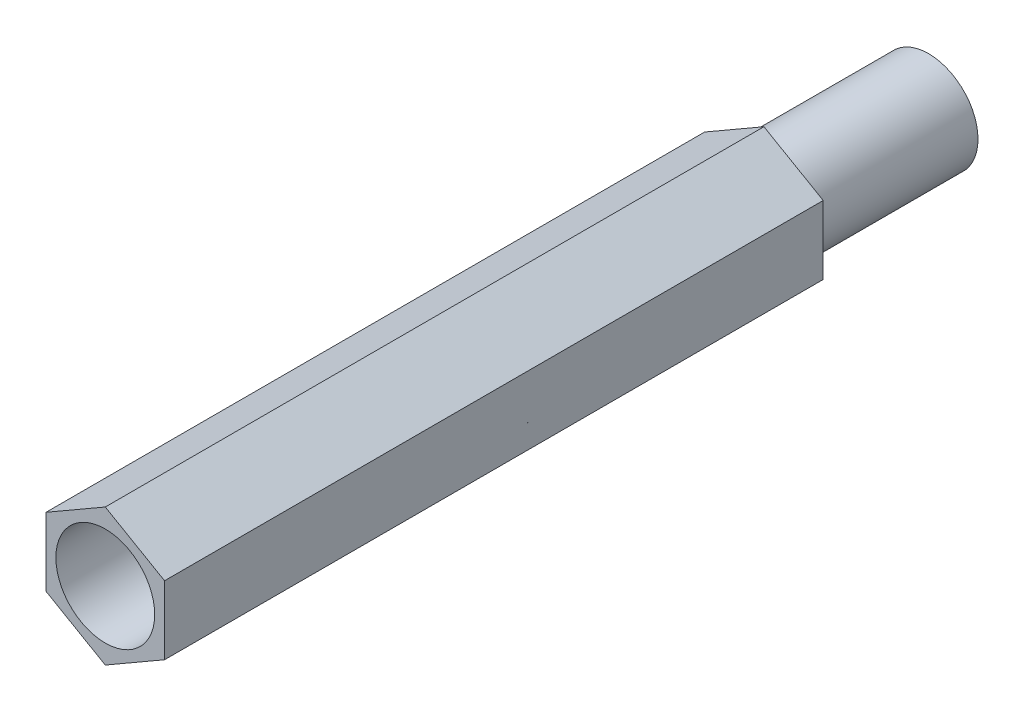
ISO-10303-21;
HEADER;
FILE_DESCRIPTION(('STEP AP214'),'2;1');
FILE_NAME('part.step','',(''),(''),'','','');
FILE_SCHEMA(('AUTOMOTIVE_DESIGN { 1 0 10303 214 1 1 1 1 }'));
ENDSEC;
DATA;
#1=APPLICATION_CONTEXT('core data for automotive mechanical design processes');
#2=APPLICATION_PROTOCOL_DEFINITION('international standard','automotive_design',2000,#1);
#3=PRODUCT_CONTEXT('',#1,'mechanical');
#4=PRODUCT('Part','Part','',(#3));
#5=PRODUCT_RELATED_PRODUCT_CATEGORY('part','',(#4));
#6=PRODUCT_DEFINITION_FORMATION('','',#4);
#7=PRODUCT_DEFINITION_CONTEXT('part definition',#1,'design');
#8=PRODUCT_DEFINITION('design','',#6,#7);
#9=PRODUCT_DEFINITION_SHAPE('','',#8);
#10=(LENGTH_UNIT() NAMED_UNIT(*) SI_UNIT(.MILLI.,.METRE.));
#11=(NAMED_UNIT(*) PLANE_ANGLE_UNIT() SI_UNIT($,.RADIAN.));
#12=(NAMED_UNIT(*) SI_UNIT($,.STERADIAN.) SOLID_ANGLE_UNIT());
#13=UNCERTAINTY_MEASURE_WITH_UNIT(LENGTH_MEASURE(1.E-05),#10,'distance_accuracy_value','');
#14=(GEOMETRIC_REPRESENTATION_CONTEXT(3) GLOBAL_UNCERTAINTY_ASSIGNED_CONTEXT((#13)) GLOBAL_UNIT_ASSIGNED_CONTEXT((#10,
#11,#12)) REPRESENTATION_CONTEXT('',''));
#15=CARTESIAN_POINT('',(0.,0.,0.));
#16=DIRECTION('',(0.,0.,1.));
#17=DIRECTION('',(1.,0.,0.));
#18=AXIS2_PLACEMENT_3D('',#15,#16,#17);
#19=CARTESIAN_POINT('',(0.,0.,20.));
#20=DIRECTION('',(0.,0.,-1.));
#21=DIRECTION('',(-1.,0.,0.));
#22=AXIS2_PLACEMENT_3D('',#19,#20,#21);
#23=CYLINDRICAL_SURFACE('',#22,1.5);
#24=CARTESIAN_POINT('',(0.,0.,20.));
#25=DIRECTION('',(0.,0.,1.));
#26=DIRECTION('',(1.,0.,0.));
#27=AXIS2_PLACEMENT_3D('',#24,#25,#26);
#28=CIRCLE('',#27,1.5);
#29=CARTESIAN_POINT('',(1.5,0.,20.));
#30=VERTEX_POINT('',#29);
#31=EDGE_CURVE('E141',#30,#30,#28,.T.);
#32=ORIENTED_EDGE('',*,*,#31,.T.);
#33=EDGE_LOOP('',(#32));
#34=FACE_BOUND('',#33,.T.);
#35=CARTESIAN_POINT('',(0.,0.,5.));
#36=DIRECTION('',(0.,0.,-1.));
#37=DIRECTION('',(-1.,0.,0.));
#38=AXIS2_PLACEMENT_3D('',#35,#36,#37);
#39=CIRCLE('',#38,1.5);
#40=CARTESIAN_POINT('',(-1.5,0.,5.));
#41=VERTEX_POINT('',#40);
#42=EDGE_CURVE('E258',#41,#41,#39,.T.);
#43=ORIENTED_EDGE('',*,*,#42,.T.);
#44=EDGE_LOOP('',(#43));
#45=FACE_BOUND('',#44,.T.);
#46=ADVANCED_FACE('F45',(#34,#45),#23,.F.);
#47=CARTESIAN_POINT('',(0.,0.,20.));
#48=DIRECTION('',(0.,0.,1.));
#49=DIRECTION('',(1.,0.,0.));
#50=AXIS2_PLACEMENT_3D('',#47,#48,#49);
#51=PLANE('',#50);
#52=DIRECTION('',(-0.866025403784439,0.5,0.));
#53=VECTOR('',#52,1.);
#54=CARTESIAN_POINT('',(1.8,1.03923048454133,20.));
#55=LINE('',#54,#53);
#56=CARTESIAN_POINT('',(1.8,1.03923048454133,20.));
#57=VERTEX_POINT('',#56);
#58=CARTESIAN_POINT('',(0.,2.07846096908265,20.));
#59=VERTEX_POINT('',#58);
#60=EDGE_CURVE('E153',#57,#59,#55,.T.);
#61=ORIENTED_EDGE('',*,*,#60,.T.);
#62=DIRECTION('',(-0.866025403784439,-0.5,0.));
#63=VECTOR('',#62,1.);
#64=CARTESIAN_POINT('',(0.,2.07846096908265,20.));
#65=LINE('',#64,#63);
#66=CARTESIAN_POINT('',(-1.8,1.03923048454133,20.));
#67=VERTEX_POINT('',#66);
#68=EDGE_CURVE('E100',#59,#67,#65,.T.);
#69=ORIENTED_EDGE('',*,*,#68,.T.);
#70=DIRECTION('',(0.,-1.,0.));
#71=VECTOR('',#70,1.);
#72=CARTESIAN_POINT('',(-1.8,1.03923048454133,20.));
#73=LINE('',#72,#71);
#74=CARTESIAN_POINT('',(-1.8,-1.03923048454133,20.));
#75=VERTEX_POINT('',#74);
#76=EDGE_CURVE('E114',#67,#75,#73,.T.);
#77=ORIENTED_EDGE('',*,*,#76,.T.);
#78=DIRECTION('',(0.866025403784439,-0.5,0.));
#79=VECTOR('',#78,1.);
#80=CARTESIAN_POINT('',(-1.8,-1.03923048454133,20.));
#81=LINE('',#80,#79);
#82=CARTESIAN_POINT('',(0.,-2.07846096908265,20.));
#83=VERTEX_POINT('',#82);
#84=EDGE_CURVE('E107',#75,#83,#81,.T.);
#85=ORIENTED_EDGE('',*,*,#84,.T.);
#86=DIRECTION('',(0.866025403784439,0.5,0.));
#87=VECTOR('',#86,1.);
#88=CARTESIAN_POINT('',(0.,-2.07846096908265,20.));
#89=LINE('',#88,#87);
#90=CARTESIAN_POINT('',(1.8,-1.03923048454133,20.));
#91=VERTEX_POINT('',#90);
#92=EDGE_CURVE('E112',#83,#91,#89,.T.);
#93=ORIENTED_EDGE('',*,*,#92,.T.);
#94=DIRECTION('',(0.,1.,0.));
#95=VECTOR('',#94,1.);
#96=CARTESIAN_POINT('',(1.8,-1.03923048454133,20.));
#97=LINE('',#96,#95);
#98=EDGE_CURVE('E63',#91,#57,#97,.T.);
#99=ORIENTED_EDGE('',*,*,#98,.T.);
#100=EDGE_LOOP('',(#61,#69,#77,#85,#93,#99));
#101=FACE_BOUND('',#100,.T.);
#102=ORIENTED_EDGE('',*,*,#31,.F.);
#103=EDGE_LOOP('',(#102));
#104=FACE_BOUND('',#103,.T.);
#105=ADVANCED_FACE('F109',(#101,#104),#51,.T.);
#106=CARTESIAN_POINT('',(0.,0.,0.));
#107=DIRECTION('',(0.,0.,1.));
#108=DIRECTION('',(1.,0.,0.));
#109=AXIS2_PLACEMENT_3D('',#106,#107,#108);
#110=PLANE('',#109);
#111=DIRECTION('',(-0.866025403784439,0.5,0.));
#112=VECTOR('',#111,1.);
#113=CARTESIAN_POINT('',(1.8,1.03923048454133,0.));
#114=LINE('',#113,#112);
#115=CARTESIAN_POINT('',(1.8,1.03923048454133,0.));
#116=VERTEX_POINT('',#115);
#117=CARTESIAN_POINT('',(0.,2.07846096908265,0.));
#118=VERTEX_POINT('',#117);
#119=EDGE_CURVE('E136',#116,#118,#114,.T.);
#120=ORIENTED_EDGE('',*,*,#119,.F.);
#121=DIRECTION('',(0.,1.,0.));
#122=VECTOR('',#121,1.);
#123=CARTESIAN_POINT('',(1.8,-1.03923048454133,0.));
#124=LINE('',#123,#122);
#125=CARTESIAN_POINT('',(1.8,-1.03923048454133,0.));
#126=VERTEX_POINT('',#125);
#127=EDGE_CURVE('E92',#126,#116,#124,.T.);
#128=ORIENTED_EDGE('',*,*,#127,.F.);
#129=DIRECTION('',(0.866025403784439,0.5,0.));
#130=VECTOR('',#129,1.);
#131=CARTESIAN_POINT('',(0.,-2.07846096908265,0.));
#132=LINE('',#131,#130);
#133=CARTESIAN_POINT('',(0.,-2.07846096908265,0.));
#134=VERTEX_POINT('',#133);
#135=EDGE_CURVE('E86',#134,#126,#132,.T.);
#136=ORIENTED_EDGE('',*,*,#135,.F.);
#137=DIRECTION('',(0.866025403784439,-0.5,0.));
#138=VECTOR('',#137,1.);
#139=CARTESIAN_POINT('',(-1.8,-1.03923048454133,0.));
#140=LINE('',#139,#138);
#141=CARTESIAN_POINT('',(-1.8,-1.03923048454133,0.));
#142=VERTEX_POINT('',#141);
#143=EDGE_CURVE('E123',#142,#134,#140,.T.);
#144=ORIENTED_EDGE('',*,*,#143,.F.);
#145=DIRECTION('',(0.,-1.,0.));
#146=VECTOR('',#145,1.);
#147=CARTESIAN_POINT('',(-1.8,1.03923048454133,0.));
#148=LINE('',#147,#146);
#149=CARTESIAN_POINT('',(-1.8,1.03923048454133,0.));
#150=VERTEX_POINT('',#149);
#151=EDGE_CURVE('E144',#150,#142,#148,.T.);
#152=ORIENTED_EDGE('',*,*,#151,.F.);
#153=DIRECTION('',(-0.866025403784439,-0.5,0.));
#154=VECTOR('',#153,1.);
#155=CARTESIAN_POINT('',(0.,2.07846096908265,0.));
#156=LINE('',#155,#154);
#157=EDGE_CURVE('E140',#118,#150,#156,.T.);
#158=ORIENTED_EDGE('',*,*,#157,.F.);
#159=EDGE_LOOP('',(#120,#128,#136,#144,#152,#158));
#160=FACE_BOUND('',#159,.T.);
#161=CARTESIAN_POINT('',(0.,0.,0.));
#162=DIRECTION('',(0.,0.,1.));
#163=DIRECTION('',(1.,0.,0.));
#164=AXIS2_PLACEMENT_3D('',#161,#162,#163);
#165=CIRCLE('',#164,1.5);
#166=CARTESIAN_POINT('',(1.5,0.,0.));
#167=VERTEX_POINT('',#166);
#168=EDGE_CURVE('E257',#167,#167,#165,.F.);
#169=ORIENTED_EDGE('',*,*,#168,.F.);
#170=EDGE_LOOP('',(#169));
#171=FACE_BOUND('',#170,.T.);
#172=ADVANCED_FACE('F166',(#160,#171),#110,.F.);
#173=CARTESIAN_POINT('',(1.8,1.03923048454133,20.));
#174=DIRECTION('',(-0.5,-0.866025403784439,0.));
#175=DIRECTION('',(0.866025403784439,-0.5,0.));
#176=AXIS2_PLACEMENT_3D('',#173,#174,#175);
#177=PLANE('',#176);
#178=ORIENTED_EDGE('',*,*,#119,.T.);
#179=DIRECTION('',(0.,0.,-1.));
#180=VECTOR('',#179,1.);
#181=CARTESIAN_POINT('',(0.,2.07846096908265,20.));
#182=LINE('',#181,#180);
#183=EDGE_CURVE('E11',#59,#118,#182,.T.);
#184=ORIENTED_EDGE('',*,*,#183,.F.);
#185=ORIENTED_EDGE('',*,*,#60,.F.);
#186=DIRECTION('',(0.,0.,-1.));
#187=VECTOR('',#186,1.);
#188=CARTESIAN_POINT('',(1.8,1.03923048454133,20.));
#189=LINE('',#188,#187);
#190=EDGE_CURVE('E132',#57,#116,#189,.T.);
#191=ORIENTED_EDGE('',*,*,#190,.T.);
#192=EDGE_LOOP('',(#178,#184,#185,#191));
#193=FACE_BOUND('',#192,.T.);
#194=ADVANCED_FACE('F47',(#193),#177,.F.);
#195=CARTESIAN_POINT('',(0.,2.07846096908265,20.));
#196=DIRECTION('',(0.5,-0.866025403784438,0.));
#197=DIRECTION('',(0.866025403784439,0.5,0.));
#198=AXIS2_PLACEMENT_3D('',#195,#196,#197);
#199=PLANE('',#198);
#200=ORIENTED_EDGE('',*,*,#157,.T.);
#201=DIRECTION('',(0.,0.,-1.));
#202=VECTOR('',#201,1.);
#203=CARTESIAN_POINT('',(-1.8,1.03923048454133,20.));
#204=LINE('',#203,#202);
#205=EDGE_CURVE('E55',#67,#150,#204,.T.);
#206=ORIENTED_EDGE('',*,*,#205,.F.);
#207=ORIENTED_EDGE('',*,*,#68,.F.);
#208=ORIENTED_EDGE('',*,*,#183,.T.);
#209=EDGE_LOOP('',(#200,#206,#207,#208));
#210=FACE_BOUND('',#209,.T.);
#211=ADVANCED_FACE('F198',(#210),#199,.F.);
#212=CARTESIAN_POINT('',(-1.8,1.03923048454133,20.));
#213=DIRECTION('',(1.,0.,0.));
#214=DIRECTION('',(0.,1.,0.));
#215=AXIS2_PLACEMENT_3D('',#212,#213,#214);
#216=PLANE('',#215);
#217=ORIENTED_EDGE('',*,*,#151,.T.);
#218=DIRECTION('',(0.,0.,-1.));
#219=VECTOR('',#218,1.);
#220=CARTESIAN_POINT('',(-1.8,-1.03923048454133,20.));
#221=LINE('',#220,#219);
#222=EDGE_CURVE('E125',#75,#142,#221,.T.);
#223=ORIENTED_EDGE('',*,*,#222,.F.);
#224=ORIENTED_EDGE('',*,*,#76,.F.);
#225=ORIENTED_EDGE('',*,*,#205,.T.);
#226=EDGE_LOOP('',(#217,#223,#224,#225));
#227=FACE_BOUND('',#226,.T.);
#228=ADVANCED_FACE('F163',(#227),#216,.F.);
#229=CARTESIAN_POINT('',(-1.8,-1.03923048454133,20.));
#230=DIRECTION('',(0.5,0.866025403784439,0.));
#231=DIRECTION('',(-0.866025403784439,0.5,0.));
#232=AXIS2_PLACEMENT_3D('',#229,#230,#231);
#233=PLANE('',#232);
#234=ORIENTED_EDGE('',*,*,#143,.T.);
#235=DIRECTION('',(0.,0.,-1.));
#236=VECTOR('',#235,1.);
#237=CARTESIAN_POINT('',(0.,-2.07846096908265,20.));
#238=LINE('',#237,#236);
#239=EDGE_CURVE('E120',#83,#134,#238,.T.);
#240=ORIENTED_EDGE('',*,*,#239,.F.);
#241=ORIENTED_EDGE('',*,*,#84,.F.);
#242=ORIENTED_EDGE('',*,*,#222,.T.);
#243=EDGE_LOOP('',(#234,#240,#241,#242));
#244=FACE_BOUND('',#243,.T.);
#245=ADVANCED_FACE('F121',(#244),#233,.F.);
#246=CARTESIAN_POINT('',(0.,-2.07846096908265,20.));
#247=DIRECTION('',(-0.5,0.866025403784439,0.));
#248=DIRECTION('',(-0.866025403784439,-0.5,0.));
#249=AXIS2_PLACEMENT_3D('',#246,#247,#248);
#250=PLANE('',#249);
#251=ORIENTED_EDGE('',*,*,#135,.T.);
#252=DIRECTION('',(0.,0.,-1.));
#253=VECTOR('',#252,1.);
#254=CARTESIAN_POINT('',(1.8,-1.03923048454133,20.));
#255=LINE('',#254,#253);
#256=EDGE_CURVE('E126',#91,#126,#255,.T.);
#257=ORIENTED_EDGE('',*,*,#256,.F.);
#258=ORIENTED_EDGE('',*,*,#92,.F.);
#259=ORIENTED_EDGE('',*,*,#239,.T.);
#260=EDGE_LOOP('',(#251,#257,#258,#259));
#261=FACE_BOUND('',#260,.T.);
#262=ADVANCED_FACE('F128',(#261),#250,.F.);
#263=CARTESIAN_POINT('',(1.8,-1.03923048454133,20.));
#264=DIRECTION('',(-1.,0.,0.));
#265=DIRECTION('',(0.,-1.,0.));
#266=AXIS2_PLACEMENT_3D('',#263,#264,#265);
#267=PLANE('',#266);
#268=ORIENTED_EDGE('',*,*,#127,.T.);
#269=ORIENTED_EDGE('',*,*,#190,.F.);
#270=ORIENTED_EDGE('',*,*,#98,.F.);
#271=ORIENTED_EDGE('',*,*,#256,.T.);
#272=EDGE_LOOP('',(#268,#269,#270,#271));
#273=FACE_BOUND('',#272,.T.);
#274=ADVANCED_FACE('F171',(#273),#267,.F.);
#275=CARTESIAN_POINT('',(0.,0.,5.));
#276=DIRECTION('',(0.,0.,-1.));
#277=DIRECTION('',(-1.,0.,0.));
#278=AXIS2_PLACEMENT_3D('',#275,#276,#277);
#279=PLANE('',#278);
#280=ORIENTED_EDGE('',*,*,#42,.F.);
#281=EDGE_LOOP('',(#280));
#282=FACE_BOUND('',#281,.T.);
#283=ADVANCED_FACE('F173',(#282),#279,.F.);
#284=CARTESIAN_POINT('',(0.,0.,-5.));
#285=DIRECTION('',(0.,0.,1.));
#286=DIRECTION('',(1.,0.,0.));
#287=AXIS2_PLACEMENT_3D('',#284,#285,#286);
#288=CYLINDRICAL_SURFACE('',#287,1.5);
#289=CARTESIAN_POINT('',(0.,0.,-5.));
#290=DIRECTION('',(0.,0.,-1.));
#291=DIRECTION('',(-1.,0.,0.));
#292=AXIS2_PLACEMENT_3D('',#289,#290,#291);
#293=CIRCLE('',#292,1.5);
#294=CARTESIAN_POINT('',(-1.5,0.,-5.));
#295=VERTEX_POINT('',#294);
#296=EDGE_CURVE('E255',#295,#295,#293,.T.);
#297=ORIENTED_EDGE('',*,*,#296,.F.);
#298=EDGE_LOOP('',(#297));
#299=FACE_BOUND('',#298,.T.);
#300=ORIENTED_EDGE('',*,*,#168,.T.);
#301=EDGE_LOOP('',(#300));
#302=FACE_BOUND('',#301,.T.);
#303=ADVANCED_FACE('F180',(#299,#302),#288,.T.);
#304=CARTESIAN_POINT('',(0.,0.,-5.));
#305=DIRECTION('',(0.,0.,-1.));
#306=DIRECTION('',(-1.,0.,0.));
#307=AXIS2_PLACEMENT_3D('',#304,#305,#306);
#308=PLANE('',#307);
#309=ORIENTED_EDGE('',*,*,#296,.T.);
#310=EDGE_LOOP('',(#309));
#311=FACE_BOUND('',#310,.T.);
#312=ADVANCED_FACE('F241',(#311),#308,.T.);
#313=CLOSED_SHELL('',(#46,#105,#172,#194,#211,#228,#245,#262,#274,#283,#303,#312));
#314=MANIFOLD_SOLID_BREP('B2',#313);
#315=ADVANCED_BREP_SHAPE_REPRESENTATION('',(#18,#314),#14);
#316=SHAPE_DEFINITION_REPRESENTATION(#9,#315);
ENDSEC;
END-ISO-10303-21;
